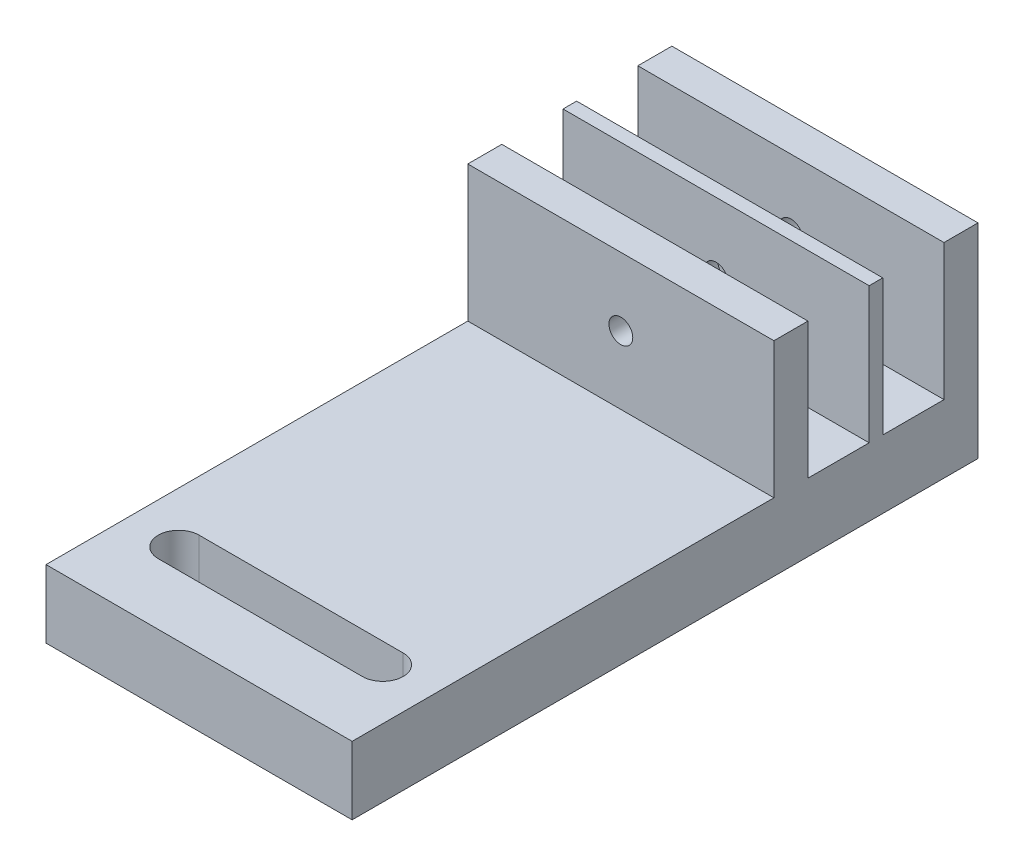
ISO-10303-21;
HEADER;
FILE_DESCRIPTION(('STEP AP214'),'2;1');
FILE_NAME('part.step','',(''),(''),'','','');
FILE_SCHEMA(('AUTOMOTIVE_DESIGN { 1 0 10303 214 1 1 1 1 }'));
ENDSEC;
DATA;
#1=APPLICATION_CONTEXT('core data for automotive mechanical design processes');
#2=APPLICATION_PROTOCOL_DEFINITION('international standard','automotive_design',2000,#1);
#3=PRODUCT_CONTEXT('',#1,'mechanical');
#4=PRODUCT('Part','Part','',(#3));
#5=PRODUCT_RELATED_PRODUCT_CATEGORY('part','',(#4));
#6=PRODUCT_DEFINITION_FORMATION('','',#4);
#7=PRODUCT_DEFINITION_CONTEXT('part definition',#1,'design');
#8=PRODUCT_DEFINITION('design','',#6,#7);
#9=PRODUCT_DEFINITION_SHAPE('','',#8);
#10=(LENGTH_UNIT() NAMED_UNIT(*) SI_UNIT(.MILLI.,.METRE.));
#11=(NAMED_UNIT(*) PLANE_ANGLE_UNIT() SI_UNIT($,.RADIAN.));
#12=(NAMED_UNIT(*) SI_UNIT($,.STERADIAN.) SOLID_ANGLE_UNIT());
#13=UNCERTAINTY_MEASURE_WITH_UNIT(LENGTH_MEASURE(1.E-05),#10,'distance_accuracy_value','');
#14=(GEOMETRIC_REPRESENTATION_CONTEXT(3) GLOBAL_UNCERTAINTY_ASSIGNED_CONTEXT((#13)) GLOBAL_UNIT_ASSIGNED_CONTEXT((#10,
#11,#12)) REPRESENTATION_CONTEXT('',''));
#15=CARTESIAN_POINT('',(0.,0.,0.));
#16=DIRECTION('',(0.,0.,1.));
#17=DIRECTION('',(1.,0.,0.));
#18=AXIS2_PLACEMENT_3D('',#15,#16,#17);
#19=CARTESIAN_POINT('',(0.,10.,0.));
#20=DIRECTION('',(0.,1.,0.));
#21=DIRECTION('',(0.,0.,1.));
#22=AXIS2_PLACEMENT_3D('',#19,#20,#21);
#23=PLANE('',#22);
#24=DIRECTION('',(0.,0.,-1.));
#25=VECTOR('',#24,1.);
#26=CARTESIAN_POINT('',(22.5,10.,0.));
#27=LINE('',#26,#25);
#28=CARTESIAN_POINT('',(22.5,10.,-49.5));
#29=VERTEX_POINT('',#28);
#30=CARTESIAN_POINT('',(22.5,10.,-58.5));
#31=VERTEX_POINT('',#30);
#32=EDGE_CURVE('E300',#29,#31,#27,.T.);
#33=ORIENTED_EDGE('',*,*,#32,.T.);
#34=DIRECTION('',(1.,0.,0.));
#35=VECTOR('',#34,1.);
#36=CARTESIAN_POINT('',(-43.1155281280883,10.,-58.5));
#37=LINE('',#36,#35);
#38=CARTESIAN_POINT('',(-22.5,10.,-58.5));
#39=VERTEX_POINT('',#38);
#40=EDGE_CURVE('E210',#39,#31,#37,.T.);
#41=ORIENTED_EDGE('',*,*,#40,.F.);
#42=DIRECTION('',(0.,0.,-1.));
#43=VECTOR('',#42,1.);
#44=CARTESIAN_POINT('',(-22.5,10.,0.));
#45=LINE('',#44,#43);
#46=CARTESIAN_POINT('',(-22.5,10.,-49.5));
#47=VERTEX_POINT('',#46);
#48=EDGE_CURVE('E63',#47,#39,#45,.T.);
#49=ORIENTED_EDGE('',*,*,#48,.F.);
#50=DIRECTION('',(1.,0.,0.));
#51=VECTOR('',#50,1.);
#52=CARTESIAN_POINT('',(-43.1155281280883,10.,-49.5));
#53=LINE('',#52,#51);
#54=EDGE_CURVE('E223',#47,#29,#53,.T.);
#55=ORIENTED_EDGE('',*,*,#54,.T.);
#56=EDGE_LOOP('',(#33,#41,#49,#55));
#57=FACE_BOUND('',#56,.T.);
#58=ADVANCED_FACE('F45',(#57),#23,.T.);
#59=CARTESIAN_POINT('',(22.5,10.,-38.5));
#60=VERTEX_POINT('',#59);
#61=CARTESIAN_POINT('',(22.5,10.,-47.5));
#62=VERTEX_POINT('',#61);
#63=EDGE_CURVE('E305',#60,#62,#27,.T.);
#64=ORIENTED_EDGE('',*,*,#63,.T.);
#65=DIRECTION('',(1.,0.,0.));
#66=VECTOR('',#65,1.);
#67=CARTESIAN_POINT('',(-43.1155281280883,10.,-47.5));
#68=LINE('',#67,#66);
#69=CARTESIAN_POINT('',(-22.5,10.,-47.5));
#70=VERTEX_POINT('',#69);
#71=EDGE_CURVE('E71',#70,#62,#68,.T.);
#72=ORIENTED_EDGE('',*,*,#71,.F.);
#73=CARTESIAN_POINT('',(-22.5,10.,-38.5));
#74=VERTEX_POINT('',#73);
#75=EDGE_CURVE('E296',#74,#70,#45,.T.);
#76=ORIENTED_EDGE('',*,*,#75,.F.);
#77=DIRECTION('',(1.,0.,0.));
#78=VECTOR('',#77,1.);
#79=CARTESIAN_POINT('',(-43.1155281280883,10.,-38.5));
#80=LINE('',#79,#78);
#81=EDGE_CURVE('E254',#74,#60,#80,.T.);
#82=ORIENTED_EDGE('',*,*,#81,.T.);
#83=EDGE_LOOP('',(#64,#72,#76,#82));
#84=FACE_BOUND('',#83,.T.);
#85=ADVANCED_FACE('F378',(#84),#23,.T.);
#86=CARTESIAN_POINT('',(0.,10.,13.5));
#87=DIRECTION('',(0.,0.,-1.));
#88=DIRECTION('',(-1.,0.,0.));
#89=AXIS2_PLACEMENT_3D('',#86,#87,#88);
#90=PLANE('',#89);
#91=DIRECTION('',(1.,0.,0.));
#92=VECTOR('',#91,1.);
#93=CARTESIAN_POINT('',(0.,0.,13.5));
#94=LINE('',#93,#92);
#95=CARTESIAN_POINT('',(-15.,0.,13.5));
#96=VERTEX_POINT('',#95);
#97=CARTESIAN_POINT('',(15.,0.,13.5));
#98=VERTEX_POINT('',#97);
#99=EDGE_CURVE('E330',#96,#98,#94,.T.);
#100=ORIENTED_EDGE('',*,*,#99,.T.);
#101=DIRECTION('',(0.,-1.,0.));
#102=VECTOR('',#101,1.);
#103=CARTESIAN_POINT('',(15.,10.,13.5));
#104=LINE('',#103,#102);
#105=CARTESIAN_POINT('',(15.,10.,13.5));
#106=VERTEX_POINT('',#105);
#107=EDGE_CURVE('E11',#106,#98,#104,.T.);
#108=ORIENTED_EDGE('',*,*,#107,.F.);
#109=DIRECTION('',(1.,0.,0.));
#110=VECTOR('',#109,1.);
#111=CARTESIAN_POINT('',(0.,10.,13.5));
#112=LINE('',#111,#110);
#113=CARTESIAN_POINT('',(-15.,10.,13.5));
#114=VERTEX_POINT('',#113);
#115=EDGE_CURVE('E304',#114,#106,#112,.T.);
#116=ORIENTED_EDGE('',*,*,#115,.F.);
#117=DIRECTION('',(0.,-1.,0.));
#118=VECTOR('',#117,1.);
#119=CARTESIAN_POINT('',(-15.,10.,13.5));
#120=LINE('',#119,#118);
#121=EDGE_CURVE('E346',#114,#96,#120,.T.);
#122=ORIENTED_EDGE('',*,*,#121,.T.);
#123=EDGE_LOOP('',(#100,#108,#116,#122));
#124=FACE_BOUND('',#123,.T.);
#125=ADVANCED_FACE('F418',(#124),#90,.F.);
#126=CARTESIAN_POINT('',(15.,10.,16.5));
#127=DIRECTION('',(0.,-1.,0.));
#128=DIRECTION('',(0.,0.,-1.));
#129=AXIS2_PLACEMENT_3D('',#126,#127,#128);
#130=CYLINDRICAL_SURFACE('',#129,3.);
#131=CARTESIAN_POINT('',(15.,0.,16.5));
#132=DIRECTION('',(0.,1.,0.));
#133=DIRECTION('',(0.,0.,1.));
#134=AXIS2_PLACEMENT_3D('',#131,#132,#133);
#135=CIRCLE('',#134,3.);
#136=CARTESIAN_POINT('',(15.,0.,19.5));
#137=VERTEX_POINT('',#136);
#138=EDGE_CURVE('E334',#98,#137,#135,.F.);
#139=ORIENTED_EDGE('',*,*,#138,.T.);
#140=DIRECTION('',(0.,-1.,0.));
#141=VECTOR('',#140,1.);
#142=CARTESIAN_POINT('',(15.,10.,19.5));
#143=LINE('',#142,#141);
#144=CARTESIAN_POINT('',(15.,10.,19.5));
#145=VERTEX_POINT('',#144);
#146=EDGE_CURVE('E55',#145,#137,#143,.T.);
#147=ORIENTED_EDGE('',*,*,#146,.F.);
#148=CARTESIAN_POINT('',(15.,10.,16.5));
#149=DIRECTION('',(0.,1.,0.));
#150=DIRECTION('',(0.,0.,1.));
#151=AXIS2_PLACEMENT_3D('',#148,#149,#150);
#152=CIRCLE('',#151,3.);
#153=EDGE_CURVE('E309',#106,#145,#152,.F.);
#154=ORIENTED_EDGE('',*,*,#153,.F.);
#155=ORIENTED_EDGE('',*,*,#107,.T.);
#156=EDGE_LOOP('',(#139,#147,#154,#155));
#157=FACE_BOUND('',#156,.T.);
#158=ADVANCED_FACE('F421',(#157),#130,.F.);
#159=CARTESIAN_POINT('',(0.,10.,19.5));
#160=DIRECTION('',(0.,0.,-1.));
#161=DIRECTION('',(-1.,0.,0.));
#162=AXIS2_PLACEMENT_3D('',#159,#160,#161);
#163=PLANE('',#162);
#164=DIRECTION('',(1.,0.,0.));
#165=VECTOR('',#164,1.);
#166=CARTESIAN_POINT('',(0.,0.,19.5));
#167=LINE('',#166,#165);
#168=CARTESIAN_POINT('',(-15.,0.,19.5));
#169=VERTEX_POINT('',#168);
#170=EDGE_CURVE('E338',#169,#137,#167,.T.);
#171=ORIENTED_EDGE('',*,*,#170,.F.);
#172=DIRECTION('',(0.,-1.,0.));
#173=VECTOR('',#172,1.);
#174=CARTESIAN_POINT('',(-15.,10.,19.5));
#175=LINE('',#174,#173);
#176=CARTESIAN_POINT('',(-15.,10.,19.5));
#177=VERTEX_POINT('',#176);
#178=EDGE_CURVE('E349',#177,#169,#175,.T.);
#179=ORIENTED_EDGE('',*,*,#178,.F.);
#180=DIRECTION('',(1.,0.,0.));
#181=VECTOR('',#180,1.);
#182=CARTESIAN_POINT('',(0.,10.,19.5));
#183=LINE('',#182,#181);
#184=EDGE_CURVE('E312',#177,#145,#183,.T.);
#185=ORIENTED_EDGE('',*,*,#184,.T.);
#186=ORIENTED_EDGE('',*,*,#146,.T.);
#187=EDGE_LOOP('',(#171,#179,#185,#186));
#188=FACE_BOUND('',#187,.T.);
#189=ADVANCED_FACE('F424',(#188),#163,.T.);
#190=CARTESIAN_POINT('',(-22.5,10.,0.));
#191=DIRECTION('',(-1.,0.,0.));
#192=DIRECTION('',(0.,0.,1.));
#193=AXIS2_PLACEMENT_3D('',#190,#191,#192);
#194=PLANE('',#193);
#195=DIRECTION('',(0.,0.,-1.));
#196=VECTOR('',#195,1.);
#197=CARTESIAN_POINT('',(-22.5,0.,0.));
#198=LINE('',#197,#196);
#199=CARTESIAN_POINT('',(-22.5,0.,28.5));
#200=VERTEX_POINT('',#199);
#201=CARTESIAN_POINT('',(-22.5,0.,-63.5));
#202=VERTEX_POINT('',#201);
#203=EDGE_CURVE('E290',#200,#202,#198,.T.);
#204=ORIENTED_EDGE('',*,*,#203,.F.);
#205=DIRECTION('',(0.,-1.,0.));
#206=VECTOR('',#205,1.);
#207=CARTESIAN_POINT('',(-22.5,10.,28.5));
#208=LINE('',#207,#206);
#209=CARTESIAN_POINT('',(-22.5,10.,28.5));
#210=VERTEX_POINT('',#209);
#211=EDGE_CURVE('E350',#210,#200,#208,.T.);
#212=ORIENTED_EDGE('',*,*,#211,.F.);
#213=CARTESIAN_POINT('',(-22.5,10.,-33.5));
#214=VERTEX_POINT('',#213);
#215=EDGE_CURVE('E291',#210,#214,#45,.T.);
#216=ORIENTED_EDGE('',*,*,#215,.T.);
#217=DIRECTION('',(0.,1.,0.));
#218=VECTOR('',#217,1.);
#219=CARTESIAN_POINT('',(-22.5,0.,-33.5));
#220=LINE('',#219,#218);
#221=CARTESIAN_POINT('',(-22.5,30.,-33.5));
#222=VERTEX_POINT('',#221);
#223=EDGE_CURVE('E249',#214,#222,#220,.T.);
#224=ORIENTED_EDGE('',*,*,#223,.T.);
#225=DIRECTION('',(0.,0.,1.));
#226=VECTOR('',#225,1.);
#227=CARTESIAN_POINT('',(-22.5,30.,0.));
#228=LINE('',#227,#226);
#229=CARTESIAN_POINT('',(-22.5,30.,-38.5));
#230=VERTEX_POINT('',#229);
#231=EDGE_CURVE('E259',#230,#222,#228,.T.);
#232=ORIENTED_EDGE('',*,*,#231,.F.);
#233=DIRECTION('',(0.,1.,0.));
#234=VECTOR('',#233,1.);
#235=CARTESIAN_POINT('',(-22.5,0.,-38.5));
#236=LINE('',#235,#234);
#237=EDGE_CURVE('E260',#74,#230,#236,.T.);
#238=ORIENTED_EDGE('',*,*,#237,.F.);
#239=ORIENTED_EDGE('',*,*,#75,.T.);
#240=DIRECTION('',(0.,1.,0.));
#241=VECTOR('',#240,1.);
#242=CARTESIAN_POINT('',(-22.5,0.,-47.5));
#243=LINE('',#242,#241);
#244=CARTESIAN_POINT('',(-22.5,30.,-47.5));
#245=VERTEX_POINT('',#244);
#246=EDGE_CURVE('E218',#70,#245,#243,.T.);
#247=ORIENTED_EDGE('',*,*,#246,.T.);
#248=DIRECTION('',(0.,0.,1.));
#249=VECTOR('',#248,1.);
#250=CARTESIAN_POINT('',(-22.5,30.0000000000001,0.));
#251=LINE('',#250,#249);
#252=CARTESIAN_POINT('',(-22.5,30.,-49.5));
#253=VERTEX_POINT('',#252);
#254=EDGE_CURVE('E227',#253,#245,#251,.T.);
#255=ORIENTED_EDGE('',*,*,#254,.F.);
#256=DIRECTION('',(0.,1.,0.));
#257=VECTOR('',#256,1.);
#258=CARTESIAN_POINT('',(-22.5,0.,-49.5));
#259=LINE('',#258,#257);
#260=EDGE_CURVE('E228',#47,#253,#259,.T.);
#261=ORIENTED_EDGE('',*,*,#260,.F.);
#262=ORIENTED_EDGE('',*,*,#48,.T.);
#263=DIRECTION('',(0.,1.,0.));
#264=VECTOR('',#263,1.);
#265=CARTESIAN_POINT('',(-22.5,0.,-58.5));
#266=LINE('',#265,#264);
#267=CARTESIAN_POINT('',(-22.5,30.,-58.5));
#268=VERTEX_POINT('',#267);
#269=EDGE_CURVE('E191',#39,#268,#266,.T.);
#270=ORIENTED_EDGE('',*,*,#269,.T.);
#271=DIRECTION('',(0.,0.,1.));
#272=VECTOR('',#271,1.);
#273=CARTESIAN_POINT('',(-22.5,30.,0.));
#274=LINE('',#273,#272);
#275=CARTESIAN_POINT('',(-22.5,30.,-63.5));
#276=VERTEX_POINT('',#275);
#277=EDGE_CURVE('E175',#276,#268,#274,.T.);
#278=ORIENTED_EDGE('',*,*,#277,.F.);
#279=DIRECTION('',(0.,1.,0.));
#280=VECTOR('',#279,1.);
#281=CARTESIAN_POINT('',(-22.5,10.,-63.5));
#282=LINE('',#281,#280);
#283=EDGE_CURVE('E270',#202,#276,#282,.T.);
#284=ORIENTED_EDGE('',*,*,#283,.F.);
#285=EDGE_LOOP('',(#204,#212,#216,#224,#232,#238,#239,#247,#255,#261,#262,#270,#278,#284));
#286=FACE_BOUND('',#285,.T.);
#287=ADVANCED_FACE('F47',(#286),#194,.T.);
#288=CARTESIAN_POINT('',(0.,10.,28.5));
#289=DIRECTION('',(0.,0.,1.));
#290=DIRECTION('',(1.,0.,0.));
#291=AXIS2_PLACEMENT_3D('',#288,#289,#290);
#292=PLANE('',#291);
#293=DIRECTION('',(-1.,0.,0.));
#294=VECTOR('',#293,1.);
#295=CARTESIAN_POINT('',(0.,0.,28.5));
#296=LINE('',#295,#294);
#297=CARTESIAN_POINT('',(22.5,0.,28.5));
#298=VERTEX_POINT('',#297);
#299=EDGE_CURVE('E323',#298,#200,#296,.T.);
#300=ORIENTED_EDGE('',*,*,#299,.F.);
#301=DIRECTION('',(0.,-1.,0.));
#302=VECTOR('',#301,1.);
#303=CARTESIAN_POINT('',(22.5,10.,28.5));
#304=LINE('',#303,#302);
#305=CARTESIAN_POINT('',(22.5,10.,28.5));
#306=VERTEX_POINT('',#305);
#307=EDGE_CURVE('E320',#306,#298,#304,.T.);
#308=ORIENTED_EDGE('',*,*,#307,.F.);
#309=DIRECTION('',(-1.,0.,0.));
#310=VECTOR('',#309,1.);
#311=CARTESIAN_POINT('',(0.,10.,28.5));
#312=LINE('',#311,#310);
#313=EDGE_CURVE('E295',#306,#210,#312,.T.);
#314=ORIENTED_EDGE('',*,*,#313,.T.);
#315=ORIENTED_EDGE('',*,*,#211,.T.);
#316=EDGE_LOOP('',(#300,#308,#314,#315));
#317=FACE_BOUND('',#316,.T.);
#318=ADVANCED_FACE('F359',(#317),#292,.T.);
#319=CARTESIAN_POINT('',(22.5,10.,0.));
#320=DIRECTION('',(-1.,0.,0.));
#321=DIRECTION('',(0.,0.,1.));
#322=AXIS2_PLACEMENT_3D('',#319,#320,#321);
#323=PLANE('',#322);
#324=DIRECTION('',(0.,0.,-1.));
#325=VECTOR('',#324,1.);
#326=CARTESIAN_POINT('',(22.5,0.,0.));
#327=LINE('',#326,#325);
#328=CARTESIAN_POINT('',(22.5,0.,-63.5));
#329=VERTEX_POINT('',#328);
#330=EDGE_CURVE('E327',#298,#329,#327,.T.);
#331=ORIENTED_EDGE('',*,*,#330,.T.);
#332=DIRECTION('',(0.,-1.,0.));
#333=VECTOR('',#332,1.);
#334=CARTESIAN_POINT('',(22.5,10.,-63.5));
#335=LINE('',#334,#333);
#336=CARTESIAN_POINT('',(22.5,30.,-63.5));
#337=VERTEX_POINT('',#336);
#338=EDGE_CURVE('E282',#337,#329,#335,.T.);
#339=ORIENTED_EDGE('',*,*,#338,.F.);
#340=DIRECTION('',(0.,0.,1.));
#341=VECTOR('',#340,1.);
#342=CARTESIAN_POINT('',(22.5,30.,0.));
#343=LINE('',#342,#341);
#344=CARTESIAN_POINT('',(22.5,30.,-58.5));
#345=VERTEX_POINT('',#344);
#346=EDGE_CURVE('E199',#337,#345,#343,.T.);
#347=ORIENTED_EDGE('',*,*,#346,.T.);
#348=DIRECTION('',(0.,1.,0.));
#349=VECTOR('',#348,1.);
#350=CARTESIAN_POINT('',(22.5,0.,-58.5));
#351=LINE('',#350,#349);
#352=EDGE_CURVE('E187',#31,#345,#351,.T.);
#353=ORIENTED_EDGE('',*,*,#352,.F.);
#354=ORIENTED_EDGE('',*,*,#32,.F.);
#355=DIRECTION('',(0.,1.,0.));
#356=VECTOR('',#355,1.);
#357=CARTESIAN_POINT('',(22.5,0.,-49.5));
#358=LINE('',#357,#356);
#359=CARTESIAN_POINT('',(22.5,30.,-49.5));
#360=VERTEX_POINT('',#359);
#361=EDGE_CURVE('E219',#29,#360,#358,.T.);
#362=ORIENTED_EDGE('',*,*,#361,.T.);
#363=DIRECTION('',(0.,0.,1.));
#364=VECTOR('',#363,1.);
#365=CARTESIAN_POINT('',(22.5,30.0000000000001,0.));
#366=LINE('',#365,#364);
#367=CARTESIAN_POINT('',(22.5,30.,-47.5));
#368=VERTEX_POINT('',#367);
#369=EDGE_CURVE('E214',#360,#368,#366,.T.);
#370=ORIENTED_EDGE('',*,*,#369,.T.);
#371=DIRECTION('',(0.,1.,0.));
#372=VECTOR('',#371,1.);
#373=CARTESIAN_POINT('',(22.5,0.,-47.5));
#374=LINE('',#373,#372);
#375=EDGE_CURVE('E203',#62,#368,#374,.T.);
#376=ORIENTED_EDGE('',*,*,#375,.F.);
#377=ORIENTED_EDGE('',*,*,#63,.F.);
#378=DIRECTION('',(0.,1.,0.));
#379=VECTOR('',#378,1.);
#380=CARTESIAN_POINT('',(22.5,0.,-38.5));
#381=LINE('',#380,#379);
#382=CARTESIAN_POINT('',(22.5,30.,-38.5));
#383=VERTEX_POINT('',#382);
#384=EDGE_CURVE('E250',#60,#383,#381,.T.);
#385=ORIENTED_EDGE('',*,*,#384,.T.);
#386=DIRECTION('',(0.,0.,1.));
#387=VECTOR('',#386,1.);
#388=CARTESIAN_POINT('',(22.5,30.,0.));
#389=LINE('',#388,#387);
#390=CARTESIAN_POINT('',(22.5,30.,-33.5));
#391=VERTEX_POINT('',#390);
#392=EDGE_CURVE('E245',#383,#391,#389,.T.);
#393=ORIENTED_EDGE('',*,*,#392,.T.);
#394=DIRECTION('',(0.,1.,0.));
#395=VECTOR('',#394,1.);
#396=CARTESIAN_POINT('',(22.5,0.,-33.5));
#397=LINE('',#396,#395);
#398=CARTESIAN_POINT('',(22.5,10.,-33.5));
#399=VERTEX_POINT('',#398);
#400=EDGE_CURVE('E255',#399,#391,#397,.T.);
#401=ORIENTED_EDGE('',*,*,#400,.F.);
#402=EDGE_CURVE('E301',#306,#399,#27,.T.);
#403=ORIENTED_EDGE('',*,*,#402,.F.);
#404=ORIENTED_EDGE('',*,*,#307,.T.);
#405=EDGE_LOOP('',(#331,#339,#347,#353,#354,#362,#370,#376,#377,#385,#393,#401,#403,#404));
#406=FACE_BOUND('',#405,.T.);
#407=ADVANCED_FACE('F368',(#406),#323,.F.);
#408=CARTESIAN_POINT('',(-15.,10.,16.5));
#409=DIRECTION('',(0.,-1.,0.));
#410=DIRECTION('',(0.,0.,-1.));
#411=AXIS2_PLACEMENT_3D('',#408,#409,#410);
#412=CYLINDRICAL_SURFACE('',#411,3.);
#413=CARTESIAN_POINT('',(-15.,0.,16.5));
#414=DIRECTION('',(0.,1.,0.));
#415=DIRECTION('',(0.,0.,1.));
#416=AXIS2_PLACEMENT_3D('',#413,#414,#415);
#417=CIRCLE('',#416,3.);
#418=EDGE_CURVE('E342',#96,#169,#417,.T.);
#419=ORIENTED_EDGE('',*,*,#418,.F.);
#420=ORIENTED_EDGE('',*,*,#121,.F.);
#421=CARTESIAN_POINT('',(-15.,10.,16.5));
#422=DIRECTION('',(0.,1.,0.));
#423=DIRECTION('',(0.,0.,1.));
#424=AXIS2_PLACEMENT_3D('',#421,#422,#423);
#425=CIRCLE('',#424,3.);
#426=EDGE_CURVE('E316',#114,#177,#425,.T.);
#427=ORIENTED_EDGE('',*,*,#426,.T.);
#428=ORIENTED_EDGE('',*,*,#178,.T.);
#429=EDGE_LOOP('',(#419,#420,#427,#428));
#430=FACE_BOUND('',#429,.T.);
#431=ADVANCED_FACE('F410',(#430),#412,.F.);
#432=DIRECTION('',(1.,0.,0.));
#433=VECTOR('',#432,1.);
#434=CARTESIAN_POINT('',(-43.1155281280883,10.,-33.5));
#435=LINE('',#434,#433);
#436=EDGE_CURVE('E238',#214,#399,#435,.T.);
#437=ORIENTED_EDGE('',*,*,#436,.F.);
#438=ORIENTED_EDGE('',*,*,#215,.F.);
#439=ORIENTED_EDGE('',*,*,#313,.F.);
#440=ORIENTED_EDGE('',*,*,#402,.T.);
#441=EDGE_LOOP('',(#437,#438,#439,#440));
#442=FACE_BOUND('',#441,.T.);
#443=ORIENTED_EDGE('',*,*,#115,.T.);
#444=ORIENTED_EDGE('',*,*,#153,.T.);
#445=ORIENTED_EDGE('',*,*,#184,.F.);
#446=ORIENTED_EDGE('',*,*,#426,.F.);
#447=EDGE_LOOP('',(#443,#444,#445,#446));
#448=FACE_BOUND('',#447,.T.);
#449=ADVANCED_FACE('F407',(#442,#448),#23,.T.);
#450=CARTESIAN_POINT('',(0.,0.,0.));
#451=DIRECTION('',(0.,1.,0.));
#452=DIRECTION('',(0.,0.,1.));
#453=AXIS2_PLACEMENT_3D('',#450,#451,#452);
#454=PLANE('',#453);
#455=ORIENTED_EDGE('',*,*,#203,.T.);
#456=DIRECTION('',(-1.,0.,0.));
#457=VECTOR('',#456,1.);
#458=CARTESIAN_POINT('',(22.5,0.,-63.5));
#459=LINE('',#458,#457);
#460=EDGE_CURVE('E286',#329,#202,#459,.T.);
#461=ORIENTED_EDGE('',*,*,#460,.F.);
#462=ORIENTED_EDGE('',*,*,#330,.F.);
#463=ORIENTED_EDGE('',*,*,#299,.T.);
#464=EDGE_LOOP('',(#455,#461,#462,#463));
#465=FACE_BOUND('',#464,.T.);
#466=ORIENTED_EDGE('',*,*,#99,.F.);
#467=ORIENTED_EDGE('',*,*,#418,.T.);
#468=ORIENTED_EDGE('',*,*,#170,.T.);
#469=ORIENTED_EDGE('',*,*,#138,.F.);
#470=EDGE_LOOP('',(#466,#467,#468,#469));
#471=FACE_BOUND('',#470,.T.);
#472=ADVANCED_FACE('F365',(#465,#471),#454,.F.);
#473=CARTESIAN_POINT('',(0.,0.,-63.5));
#474=DIRECTION('',(0.,0.,-1.));
#475=DIRECTION('',(-1.,0.,0.));
#476=AXIS2_PLACEMENT_3D('',#473,#474,#475);
#477=PLANE('',#476);
#478=CARTESIAN_POINT('',(0.,20.,-63.5));
#479=DIRECTION('',(0.,0.,-1.));
#480=DIRECTION('',(-1.,0.,0.));
#481=AXIS2_PLACEMENT_3D('',#478,#479,#480);
#482=CIRCLE('',#481,1.75);
#483=CARTESIAN_POINT('',(1.75,20.,-63.5));
#484=VERTEX_POINT('',#483);
#485=EDGE_CURVE('E480',#484,#484,#482,.F.);
#486=ORIENTED_EDGE('',*,*,#485,.T.);
#487=EDGE_LOOP('',(#486));
#488=FACE_BOUND('',#487,.T.);
#489=ORIENTED_EDGE('',*,*,#283,.T.);
#490=DIRECTION('',(1.,0.,0.));
#491=VECTOR('',#490,1.);
#492=CARTESIAN_POINT('',(-43.1155281280883,30.,-63.5));
#493=LINE('',#492,#491);
#494=EDGE_CURVE('E182',#276,#337,#493,.T.);
#495=ORIENTED_EDGE('',*,*,#494,.T.);
#496=ORIENTED_EDGE('',*,*,#338,.T.);
#497=ORIENTED_EDGE('',*,*,#460,.T.);
#498=EDGE_LOOP('',(#489,#495,#496,#497));
#499=FACE_BOUND('',#498,.T.);
#500=ADVANCED_FACE('F371',(#488,#499),#477,.T.);
#501=CARTESIAN_POINT('',(-43.1155281280883,0.,-33.5));
#502=DIRECTION('',(0.,0.,-1.));
#503=DIRECTION('',(0.,1.,0.));
#504=AXIS2_PLACEMENT_3D('',#501,#502,#503);
#505=PLANE('',#504);
#506=CARTESIAN_POINT('',(0.,20.,-33.5));
#507=DIRECTION('',(0.,0.,1.));
#508=DIRECTION('',(1.,0.,0.));
#509=AXIS2_PLACEMENT_3D('',#506,#507,#508);
#510=CIRCLE('',#509,1.75);
#511=CARTESIAN_POINT('',(1.75,20.,-33.5));
#512=VERTEX_POINT('',#511);
#513=EDGE_CURVE('E490',#512,#512,#510,.T.);
#514=ORIENTED_EDGE('',*,*,#513,.F.);
#515=EDGE_LOOP('',(#514));
#516=FACE_BOUND('',#515,.T.);
#517=ORIENTED_EDGE('',*,*,#223,.F.);
#518=ORIENTED_EDGE('',*,*,#436,.T.);
#519=ORIENTED_EDGE('',*,*,#400,.T.);
#520=DIRECTION('',(1.,0.,0.));
#521=VECTOR('',#520,1.);
#522=CARTESIAN_POINT('',(-43.1155281280883,30.,-33.5));
#523=LINE('',#522,#521);
#524=EDGE_CURVE('E264',#222,#391,#523,.T.);
#525=ORIENTED_EDGE('',*,*,#524,.F.);
#526=EDGE_LOOP('',(#517,#518,#519,#525));
#527=FACE_BOUND('',#526,.T.);
#528=ADVANCED_FACE('F405',(#516,#527),#505,.F.);
#529=CARTESIAN_POINT('',(-43.1155281280883,30.,0.));
#530=DIRECTION('',(0.,1.,0.));
#531=DIRECTION('',(0.,0.,1.));
#532=AXIS2_PLACEMENT_3D('',#529,#530,#531);
#533=PLANE('',#532);
#534=DIRECTION('',(1.,0.,0.));
#535=VECTOR('',#534,1.);
#536=CARTESIAN_POINT('',(-43.1155281280883,30.,-38.5));
#537=LINE('',#536,#535);
#538=EDGE_CURVE('E263',#230,#383,#537,.T.);
#539=ORIENTED_EDGE('',*,*,#538,.F.);
#540=ORIENTED_EDGE('',*,*,#231,.T.);
#541=ORIENTED_EDGE('',*,*,#524,.T.);
#542=ORIENTED_EDGE('',*,*,#392,.F.);
#543=EDGE_LOOP('',(#539,#540,#541,#542));
#544=FACE_BOUND('',#543,.T.);
#545=ADVANCED_FACE('F401',(#544),#533,.T.);
#546=CARTESIAN_POINT('',(-43.1155281280883,0.,-38.5));
#547=DIRECTION('',(0.,0.,-1.));
#548=DIRECTION('',(-1.,0.,0.));
#549=AXIS2_PLACEMENT_3D('',#546,#547,#548);
#550=PLANE('',#549);
#551=CARTESIAN_POINT('',(0.,20.,-38.5));
#552=DIRECTION('',(0.,0.,-1.));
#553=DIRECTION('',(-1.,0.,0.));
#554=AXIS2_PLACEMENT_3D('',#551,#552,#553);
#555=CIRCLE('',#554,1.75);
#556=CARTESIAN_POINT('',(1.75,20.,-38.5));
#557=VERTEX_POINT('',#556);
#558=EDGE_CURVE('E213',#557,#557,#555,.T.);
#559=ORIENTED_EDGE('',*,*,#558,.F.);
#560=EDGE_LOOP('',(#559));
#561=FACE_BOUND('',#560,.T.);
#562=ORIENTED_EDGE('',*,*,#81,.F.);
#563=ORIENTED_EDGE('',*,*,#237,.T.);
#564=ORIENTED_EDGE('',*,*,#538,.T.);
#565=ORIENTED_EDGE('',*,*,#384,.F.);
#566=EDGE_LOOP('',(#562,#563,#564,#565));
#567=FACE_BOUND('',#566,.T.);
#568=ADVANCED_FACE('F396',(#561,#567),#550,.T.);
#569=CARTESIAN_POINT('',(-43.1155281280883,0.,-47.5));
#570=DIRECTION('',(0.,0.,-1.));
#571=DIRECTION('',(-1.,0.,0.));
#572=AXIS2_PLACEMENT_3D('',#569,#570,#571);
#573=PLANE('',#572);
#574=CARTESIAN_POINT('',(0.,20.,-47.5));
#575=DIRECTION('',(0.,0.,-1.));
#576=DIRECTION('',(-1.,0.,0.));
#577=AXIS2_PLACEMENT_3D('',#574,#575,#576);
#578=CIRCLE('',#577,1.75);
#579=CARTESIAN_POINT('',(1.75,20.,-47.5));
#580=VERTEX_POINT('',#579);
#581=EDGE_CURVE('E488',#580,#580,#578,.T.);
#582=ORIENTED_EDGE('',*,*,#581,.T.);
#583=EDGE_LOOP('',(#582));
#584=FACE_BOUND('',#583,.T.);
#585=ORIENTED_EDGE('',*,*,#246,.F.);
#586=ORIENTED_EDGE('',*,*,#71,.T.);
#587=ORIENTED_EDGE('',*,*,#375,.T.);
#588=DIRECTION('',(1.,0.,0.));
#589=VECTOR('',#588,1.);
#590=CARTESIAN_POINT('',(-43.1155281280883,30.,-47.5));
#591=LINE('',#590,#589);
#592=EDGE_CURVE('E232',#245,#368,#591,.T.);
#593=ORIENTED_EDGE('',*,*,#592,.F.);
#594=EDGE_LOOP('',(#585,#586,#587,#593));
#595=FACE_BOUND('',#594,.T.);
#596=ADVANCED_FACE('F384',(#584,#595),#573,.F.);
#597=CARTESIAN_POINT('',(-43.1155281280883,30.0000000000001,0.));
#598=DIRECTION('',(0.,1.,0.));
#599=DIRECTION('',(0.,0.,1.));
#600=AXIS2_PLACEMENT_3D('',#597,#598,#599);
#601=PLANE('',#600);
#602=DIRECTION('',(1.,0.,0.));
#603=VECTOR('',#602,1.);
#604=CARTESIAN_POINT('',(-43.1155281280883,30.,-49.5));
#605=LINE('',#604,#603);
#606=EDGE_CURVE('E231',#253,#360,#605,.T.);
#607=ORIENTED_EDGE('',*,*,#606,.F.);
#608=ORIENTED_EDGE('',*,*,#254,.T.);
#609=ORIENTED_EDGE('',*,*,#592,.T.);
#610=ORIENTED_EDGE('',*,*,#369,.F.);
#611=EDGE_LOOP('',(#607,#608,#609,#610));
#612=FACE_BOUND('',#611,.T.);
#613=ADVANCED_FACE('F389',(#612),#601,.T.);
#614=CARTESIAN_POINT('',(-43.1155281280883,0.,-49.5));
#615=DIRECTION('',(0.,0.,-1.));
#616=DIRECTION('',(-1.,0.,0.));
#617=AXIS2_PLACEMENT_3D('',#614,#615,#616);
#618=PLANE('',#617);
#619=CARTESIAN_POINT('',(0.,20.,-49.5));
#620=DIRECTION('',(0.,0.,-1.));
#621=DIRECTION('',(-1.,0.,0.));
#622=AXIS2_PLACEMENT_3D('',#619,#620,#621);
#623=CIRCLE('',#622,1.75);
#624=CARTESIAN_POINT('',(1.75,20.,-49.5));
#625=VERTEX_POINT('',#624);
#626=EDGE_CURVE('E484',#625,#625,#623,.T.);
#627=ORIENTED_EDGE('',*,*,#626,.F.);
#628=EDGE_LOOP('',(#627));
#629=FACE_BOUND('',#628,.T.);
#630=ORIENTED_EDGE('',*,*,#54,.F.);
#631=ORIENTED_EDGE('',*,*,#260,.T.);
#632=ORIENTED_EDGE('',*,*,#606,.T.);
#633=ORIENTED_EDGE('',*,*,#361,.F.);
#634=EDGE_LOOP('',(#630,#631,#632,#633));
#635=FACE_BOUND('',#634,.T.);
#636=ADVANCED_FACE('F453',(#629,#635),#618,.T.);
#637=CARTESIAN_POINT('',(-43.1155281280883,0.,-58.5));
#638=DIRECTION('',(0.,0.,-1.));
#639=DIRECTION('',(-1.,0.,0.));
#640=AXIS2_PLACEMENT_3D('',#637,#638,#639);
#641=PLANE('',#640);
#642=CARTESIAN_POINT('',(0.,20.,-58.5));
#643=DIRECTION('',(0.,0.,-1.));
#644=DIRECTION('',(-1.,0.,0.));
#645=AXIS2_PLACEMENT_3D('',#642,#643,#644);
#646=CIRCLE('',#645,1.75);
#647=CARTESIAN_POINT('',(1.75,20.,-58.5));
#648=VERTEX_POINT('',#647);
#649=EDGE_CURVE('E49',#648,#648,#646,.T.);
#650=ORIENTED_EDGE('',*,*,#649,.T.);
#651=EDGE_LOOP('',(#650));
#652=FACE_BOUND('',#651,.T.);
#653=ORIENTED_EDGE('',*,*,#269,.F.);
#654=ORIENTED_EDGE('',*,*,#40,.T.);
#655=ORIENTED_EDGE('',*,*,#352,.T.);
#656=DIRECTION('',(1.,0.,0.));
#657=VECTOR('',#656,1.);
#658=CARTESIAN_POINT('',(-43.1155281280883,30.,-58.5));
#659=LINE('',#658,#657);
#660=EDGE_CURVE('E179',#268,#345,#659,.T.);
#661=ORIENTED_EDGE('',*,*,#660,.F.);
#662=EDGE_LOOP('',(#653,#654,#655,#661));
#663=FACE_BOUND('',#662,.T.);
#664=ADVANCED_FACE('F190',(#652,#663),#641,.F.);
#665=CARTESIAN_POINT('',(-43.1155281280883,30.,0.));
#666=DIRECTION('',(0.,1.,0.));
#667=DIRECTION('',(0.,0.,1.));
#668=AXIS2_PLACEMENT_3D('',#665,#666,#667);
#669=PLANE('',#668);
#670=ORIENTED_EDGE('',*,*,#494,.F.);
#671=ORIENTED_EDGE('',*,*,#277,.T.);
#672=ORIENTED_EDGE('',*,*,#660,.T.);
#673=ORIENTED_EDGE('',*,*,#346,.F.);
#674=EDGE_LOOP('',(#670,#671,#672,#673));
#675=FACE_BOUND('',#674,.T.);
#676=ADVANCED_FACE('F177',(#675),#669,.T.);
#677=CARTESIAN_POINT('',(0.,20.,-68.4497474683058));
#678=DIRECTION('',(0.,0.,1.));
#679=DIRECTION('',(1.,0.,0.));
#680=AXIS2_PLACEMENT_3D('',#677,#678,#679);
#681=CYLINDRICAL_SURFACE('',#680,1.75);
#682=CARTESIAN_POINT('',(1.75,20.,-63.5));
#683=CARTESIAN_POINT('',(1.75,20.,-63.4479166666667));
#684=CARTESIAN_POINT('',(1.75,20.,-63.3958333333333));
#685=CARTESIAN_POINT('',(1.75,20.,-63.2916666666667));
#686=CARTESIAN_POINT('',(1.75,20.,-63.2395833333333));
#687=CARTESIAN_POINT('',(1.75,20.,-63.1354166666667));
#688=CARTESIAN_POINT('',(1.75,20.,-63.0833333333333));
#689=CARTESIAN_POINT('',(1.75,20.,-62.9791666666667));
#690=CARTESIAN_POINT('',(1.75,20.,-62.9270833333333));
#691=CARTESIAN_POINT('',(1.75,20.,-62.8229166666667));
#692=CARTESIAN_POINT('',(1.75,20.,-62.7708333333333));
#693=CARTESIAN_POINT('',(1.75,20.,-62.6666666666667));
#694=CARTESIAN_POINT('',(1.75,20.,-62.6145833333333));
#695=CARTESIAN_POINT('',(1.75,20.,-62.5104166666667));
#696=CARTESIAN_POINT('',(1.75,20.,-62.4583333333333));
#697=CARTESIAN_POINT('',(1.75,20.,-62.3541666666667));
#698=CARTESIAN_POINT('',(1.75,20.,-62.3020833333333));
#699=CARTESIAN_POINT('',(1.75,20.,-62.1979166666667));
#700=CARTESIAN_POINT('',(1.75,20.,-62.1458333333333));
#701=CARTESIAN_POINT('',(1.75,20.,-62.0416666666667));
#702=CARTESIAN_POINT('',(1.75,20.,-61.9895833333333));
#703=CARTESIAN_POINT('',(1.75,20.,-61.8854166666667));
#704=CARTESIAN_POINT('',(1.75,20.,-61.8333333333333));
#705=CARTESIAN_POINT('',(1.75,20.,-61.7291666666667));
#706=CARTESIAN_POINT('',(1.75,20.,-61.6770833333333));
#707=CARTESIAN_POINT('',(1.75,20.,-61.5729166666667));
#708=CARTESIAN_POINT('',(1.75,20.,-61.5208333333333));
#709=CARTESIAN_POINT('',(1.75,20.,-61.4166666666667));
#710=CARTESIAN_POINT('',(1.75,20.,-61.3645833333333));
#711=CARTESIAN_POINT('',(1.75,20.,-61.2604166666667));
#712=CARTESIAN_POINT('',(1.75,20.,-61.2083333333333));
#713=CARTESIAN_POINT('',(1.75,20.,-61.1041666666667));
#714=CARTESIAN_POINT('',(1.75,20.,-61.0520833333333));
#715=CARTESIAN_POINT('',(1.75,20.,-60.9479166666667));
#716=CARTESIAN_POINT('',(1.75,20.,-60.8958333333333));
#717=CARTESIAN_POINT('',(1.75,20.,-60.7916666666667));
#718=CARTESIAN_POINT('',(1.75,20.,-60.7395833333333));
#719=CARTESIAN_POINT('',(1.75,20.,-60.6354166666667));
#720=CARTESIAN_POINT('',(1.75,20.,-60.5833333333333));
#721=CARTESIAN_POINT('',(1.75,20.,-60.4791666666667));
#722=CARTESIAN_POINT('',(1.75,20.,-60.4270833333333));
#723=CARTESIAN_POINT('',(1.75,20.,-60.3229166666667));
#724=CARTESIAN_POINT('',(1.75,20.,-60.2708333333333));
#725=CARTESIAN_POINT('',(1.75,20.,-60.1666666666667));
#726=CARTESIAN_POINT('',(1.75,20.,-60.1145833333333));
#727=CARTESIAN_POINT('',(1.75,20.,-60.0104166666667));
#728=CARTESIAN_POINT('',(1.75,20.,-59.9583333333333));
#729=CARTESIAN_POINT('',(1.75,20.,-59.8541666666667));
#730=CARTESIAN_POINT('',(1.75,20.,-59.8020833333333));
#731=CARTESIAN_POINT('',(1.75,20.,-59.6979166666667));
#732=CARTESIAN_POINT('',(1.75,20.,-59.6458333333333));
#733=CARTESIAN_POINT('',(1.75,20.,-59.5416666666667));
#734=CARTESIAN_POINT('',(1.75,20.,-59.4895833333333));
#735=CARTESIAN_POINT('',(1.75,20.,-59.3854166666667));
#736=CARTESIAN_POINT('',(1.75,20.,-59.3333333333333));
#737=CARTESIAN_POINT('',(1.75,20.,-59.2291666666667));
#738=CARTESIAN_POINT('',(1.75,20.,-59.1770833333333));
#739=CARTESIAN_POINT('',(1.75,20.,-59.0729166666667));
#740=CARTESIAN_POINT('',(1.75,20.,-59.0208333333333));
#741=CARTESIAN_POINT('',(1.75,20.,-58.9166666666667));
#742=CARTESIAN_POINT('',(1.75,20.,-58.8645833333333));
#743=CARTESIAN_POINT('',(1.75,20.,-58.7604166666667));
#744=CARTESIAN_POINT('',(1.75,20.,-58.7083333333333));
#745=CARTESIAN_POINT('',(1.75,20.,-58.6041666666667));
#746=CARTESIAN_POINT('',(1.75,20.,-58.5520833333333));
#747=CARTESIAN_POINT('',(1.75,20.,-58.5));
#748=B_SPLINE_CURVE_WITH_KNOTS('',3,(#682,#683,#684,#685,#686,#687,#688,#689,#690,#691,#692,
#693,#694,#695,#696,#697,#698,#699,#700,#701,#702,#703,#704,#705,#706,#707,#708,#709,#710,#711,
#712,#713,#714,#715,#716,#717,#718,#719,#720,#721,#722,#723,#724,#725,#726,#727,#728,#729,#730,
#731,#732,#733,#734,#735,#736,#737,#738,#739,#740,#741,#742,#743,#744,#745,#746,#747),
.UNSPECIFIED.,.F.,.F.,(4,2,2,2,2,2,2,2,2,2,2,2,2,2,2,2,2,2,2,2,2,2,2,2,2,2,2,2,2,2,2,2,4),(0.,
0.156250000000011,0.312500000000007,0.468750000000004,0.625000000000001,0.781250000000011,
0.937500000000008,1.09375,1.25,1.40625,1.5625,1.71875,1.875,2.03125000000001,2.1875,
2.34375000000001,2.5,2.65625000000001,2.8125,2.96875,3.125,3.28125,3.4375,3.59375,3.75,3.90625,
4.0625,4.21875,4.375,4.53125,4.6875,4.84375,5.),.UNSPECIFIED.);
#749=EDGE_CURVE('BSEAM462',#484,#648,#748,.T.);
#750=ORIENTED_EDGE('',*,*,#485,.F.);
#751=ORIENTED_EDGE('',*,*,#649,.F.);
#752=ORIENTED_EDGE('',*,*,#749,.T.);
#753=ORIENTED_EDGE('',*,*,#749,.F.);
#754=EDGE_LOOP('',(#750,#752,#751,#753));
#755=FACE_BOUND('',#754,.T.);
#756=ADVANCED_FACE('F462',(#755),#681,.F.);
#757=CARTESIAN_POINT('',(1.75,20.,-49.5));
#758=CARTESIAN_POINT('',(1.75,20.,-49.4791666666667));
#759=CARTESIAN_POINT('',(1.75,20.,-49.4583333333333));
#760=CARTESIAN_POINT('',(1.75,20.,-49.4166666666667));
#761=CARTESIAN_POINT('',(1.75,20.,-49.3958333333333));
#762=CARTESIAN_POINT('',(1.75,20.,-49.3541666666667));
#763=CARTESIAN_POINT('',(1.75,20.,-49.3333333333333));
#764=CARTESIAN_POINT('',(1.75,20.,-49.2916666666667));
#765=CARTESIAN_POINT('',(1.75,20.,-49.2708333333333));
#766=CARTESIAN_POINT('',(1.75,20.,-49.2291666666667));
#767=CARTESIAN_POINT('',(1.75,20.,-49.2083333333333));
#768=CARTESIAN_POINT('',(1.75,20.,-49.1666666666667));
#769=CARTESIAN_POINT('',(1.75,20.,-49.1458333333333));
#770=CARTESIAN_POINT('',(1.75,20.,-49.1041666666667));
#771=CARTESIAN_POINT('',(1.75,20.,-49.0833333333333));
#772=CARTESIAN_POINT('',(1.75,20.,-49.0416666666667));
#773=CARTESIAN_POINT('',(1.75,20.,-49.0208333333333));
#774=CARTESIAN_POINT('',(1.75,20.,-48.9791666666667));
#775=CARTESIAN_POINT('',(1.75,20.,-48.9583333333333));
#776=CARTESIAN_POINT('',(1.75,20.,-48.9166666666667));
#777=CARTESIAN_POINT('',(1.75,20.,-48.8958333333333));
#778=CARTESIAN_POINT('',(1.75,20.,-48.8541666666667));
#779=CARTESIAN_POINT('',(1.75,20.,-48.8333333333333));
#780=CARTESIAN_POINT('',(1.75,20.,-48.7916666666667));
#781=CARTESIAN_POINT('',(1.75,20.,-48.7708333333333));
#782=CARTESIAN_POINT('',(1.75,20.,-48.7291666666667));
#783=CARTESIAN_POINT('',(1.75,20.,-48.7083333333333));
#784=CARTESIAN_POINT('',(1.75,20.,-48.6666666666667));
#785=CARTESIAN_POINT('',(1.75,20.,-48.6458333333333));
#786=CARTESIAN_POINT('',(1.75,20.,-48.6041666666667));
#787=CARTESIAN_POINT('',(1.75,20.,-48.5833333333333));
#788=CARTESIAN_POINT('',(1.75,20.,-48.5416666666667));
#789=CARTESIAN_POINT('',(1.75,20.,-48.5208333333333));
#790=CARTESIAN_POINT('',(1.75,20.,-48.4791666666667));
#791=CARTESIAN_POINT('',(1.75,20.,-48.4583333333333));
#792=CARTESIAN_POINT('',(1.75,20.,-48.4166666666667));
#793=CARTESIAN_POINT('',(1.75,20.,-48.3958333333333));
#794=CARTESIAN_POINT('',(1.75,20.,-48.3541666666667));
#795=CARTESIAN_POINT('',(1.75,20.,-48.3333333333333));
#796=CARTESIAN_POINT('',(1.75,20.,-48.2916666666667));
#797=CARTESIAN_POINT('',(1.75,20.,-48.2708333333333));
#798=CARTESIAN_POINT('',(1.75,20.,-48.2291666666667));
#799=CARTESIAN_POINT('',(1.75,20.,-48.2083333333333));
#800=CARTESIAN_POINT('',(1.75,20.,-48.1666666666667));
#801=CARTESIAN_POINT('',(1.75,20.,-48.1458333333333));
#802=CARTESIAN_POINT('',(1.75,20.,-48.1041666666667));
#803=CARTESIAN_POINT('',(1.75,20.,-48.0833333333333));
#804=CARTESIAN_POINT('',(1.75,20.,-48.0416666666667));
#805=CARTESIAN_POINT('',(1.75,20.,-48.0208333333333));
#806=CARTESIAN_POINT('',(1.75,20.,-47.9791666666667));
#807=CARTESIAN_POINT('',(1.75,20.,-47.9583333333333));
#808=CARTESIAN_POINT('',(1.75,20.,-47.9166666666667));
#809=CARTESIAN_POINT('',(1.75,20.,-47.8958333333333));
#810=CARTESIAN_POINT('',(1.75,20.,-47.8541666666667));
#811=CARTESIAN_POINT('',(1.75,20.,-47.8333333333333));
#812=CARTESIAN_POINT('',(1.75,20.,-47.7916666666667));
#813=CARTESIAN_POINT('',(1.75,20.,-47.7708333333333));
#814=CARTESIAN_POINT('',(1.75,20.,-47.7291666666667));
#815=CARTESIAN_POINT('',(1.75,20.,-47.7083333333333));
#816=CARTESIAN_POINT('',(1.75,20.,-47.6666666666667));
#817=CARTESIAN_POINT('',(1.75,20.,-47.6458333333333));
#818=CARTESIAN_POINT('',(1.75,20.,-47.6041666666667));
#819=CARTESIAN_POINT('',(1.75,20.,-47.5833333333333));
#820=CARTESIAN_POINT('',(1.75,20.,-47.5416666666667));
#821=CARTESIAN_POINT('',(1.75,20.,-47.5208333333333));
#822=CARTESIAN_POINT('',(1.75,20.,-47.5));
#823=B_SPLINE_CURVE_WITH_KNOTS('',3,(#757,#758,#759,#760,#761,#762,#763,#764,#765,#766,#767,
#768,#769,#770,#771,#772,#773,#774,#775,#776,#777,#778,#779,#780,#781,#782,#783,#784,#785,#786,
#787,#788,#789,#790,#791,#792,#793,#794,#795,#796,#797,#798,#799,#800,#801,#802,#803,#804,#805,
#806,#807,#808,#809,#810,#811,#812,#813,#814,#815,#816,#817,#818,#819,#820,#821,#822),
.UNSPECIFIED.,.F.,.F.,(4,2,2,2,2,2,2,2,2,2,2,2,2,2,2,2,2,2,2,2,2,2,2,2,2,2,2,2,2,2,2,2,4),(0.,
0.062500000000007,0.125,0.187500000000007,0.25,0.312500000000007,0.375,0.437500000000007,0.5,
0.562500000000007,0.625000000000001,0.687500000000008,0.750000000000001,0.812500000000008,
0.875000000000001,0.937500000000008,1.,1.06250000000001,1.125,1.18750000000001,1.25,
1.31250000000001,1.375,1.43750000000001,1.5,1.56250000000001,1.625,1.68750000000001,1.75,
1.81250000000001,1.875,1.93750000000001,2.),.UNSPECIFIED.);
#824=EDGE_CURVE('BSEAM465',#625,#580,#823,.T.);
#825=ORIENTED_EDGE('',*,*,#626,.T.);
#826=ORIENTED_EDGE('',*,*,#581,.F.);
#827=ORIENTED_EDGE('',*,*,#824,.T.);
#828=ORIENTED_EDGE('',*,*,#824,.F.);
#829=EDGE_LOOP('',(#825,#827,#826,#828));
#830=FACE_BOUND('',#829,.T.);
#831=ADVANCED_FACE('F465',(#830),#681,.F.);
#832=CARTESIAN_POINT('',(1.75,20.,-38.5));
#833=CARTESIAN_POINT('',(1.75,20.,-38.4479166666667));
#834=CARTESIAN_POINT('',(1.75,20.,-38.3958333333333));
#835=CARTESIAN_POINT('',(1.75,20.,-38.2916666666667));
#836=CARTESIAN_POINT('',(1.75,20.,-38.2395833333333));
#837=CARTESIAN_POINT('',(1.75,20.,-38.1354166666667));
#838=CARTESIAN_POINT('',(1.75,20.,-38.0833333333333));
#839=CARTESIAN_POINT('',(1.75,20.,-37.9791666666667));
#840=CARTESIAN_POINT('',(1.75,20.,-37.9270833333333));
#841=CARTESIAN_POINT('',(1.75,20.,-37.8229166666667));
#842=CARTESIAN_POINT('',(1.75,20.,-37.7708333333333));
#843=CARTESIAN_POINT('',(1.75,20.,-37.6666666666667));
#844=CARTESIAN_POINT('',(1.75,20.,-37.6145833333333));
#845=CARTESIAN_POINT('',(1.75,20.,-37.5104166666667));
#846=CARTESIAN_POINT('',(1.75,20.,-37.4583333333333));
#847=CARTESIAN_POINT('',(1.75,20.,-37.3541666666667));
#848=CARTESIAN_POINT('',(1.75,20.,-37.3020833333333));
#849=CARTESIAN_POINT('',(1.75,20.,-37.1979166666667));
#850=CARTESIAN_POINT('',(1.75,20.,-37.1458333333333));
#851=CARTESIAN_POINT('',(1.75,20.,-37.0416666666667));
#852=CARTESIAN_POINT('',(1.75,20.,-36.9895833333333));
#853=CARTESIAN_POINT('',(1.75,20.,-36.8854166666667));
#854=CARTESIAN_POINT('',(1.75,20.,-36.8333333333333));
#855=CARTESIAN_POINT('',(1.75,20.,-36.7291666666667));
#856=CARTESIAN_POINT('',(1.75,20.,-36.6770833333333));
#857=CARTESIAN_POINT('',(1.75,20.,-36.5729166666667));
#858=CARTESIAN_POINT('',(1.75,20.,-36.5208333333333));
#859=CARTESIAN_POINT('',(1.75,20.,-36.4166666666667));
#860=CARTESIAN_POINT('',(1.75,20.,-36.3645833333333));
#861=CARTESIAN_POINT('',(1.75,20.,-36.2604166666667));
#862=CARTESIAN_POINT('',(1.75,20.,-36.2083333333333));
#863=CARTESIAN_POINT('',(1.75,20.,-36.1041666666667));
#864=CARTESIAN_POINT('',(1.75,20.,-36.0520833333333));
#865=CARTESIAN_POINT('',(1.75,20.,-35.9479166666667));
#866=CARTESIAN_POINT('',(1.75,20.,-35.8958333333333));
#867=CARTESIAN_POINT('',(1.75,20.,-35.7916666666667));
#868=CARTESIAN_POINT('',(1.75,20.,-35.7395833333333));
#869=CARTESIAN_POINT('',(1.75,20.,-35.6354166666667));
#870=CARTESIAN_POINT('',(1.75,20.,-35.5833333333333));
#871=CARTESIAN_POINT('',(1.75,20.,-35.4791666666667));
#872=CARTESIAN_POINT('',(1.75,20.,-35.4270833333333));
#873=CARTESIAN_POINT('',(1.75,20.,-35.3229166666667));
#874=CARTESIAN_POINT('',(1.75,20.,-35.2708333333333));
#875=CARTESIAN_POINT('',(1.75,20.,-35.1666666666667));
#876=CARTESIAN_POINT('',(1.75,20.,-35.1145833333333));
#877=CARTESIAN_POINT('',(1.75,20.,-35.0104166666667));
#878=CARTESIAN_POINT('',(1.75,20.,-34.9583333333333));
#879=CARTESIAN_POINT('',(1.75,20.,-34.8541666666667));
#880=CARTESIAN_POINT('',(1.75,20.,-34.8020833333333));
#881=CARTESIAN_POINT('',(1.75,20.,-34.6979166666667));
#882=CARTESIAN_POINT('',(1.75,20.,-34.6458333333333));
#883=CARTESIAN_POINT('',(1.75,20.,-34.5416666666667));
#884=CARTESIAN_POINT('',(1.75,20.,-34.4895833333333));
#885=CARTESIAN_POINT('',(1.75,20.,-34.3854166666667));
#886=CARTESIAN_POINT('',(1.75,20.,-34.3333333333333));
#887=CARTESIAN_POINT('',(1.75,20.,-34.2291666666667));
#888=CARTESIAN_POINT('',(1.75,20.,-34.1770833333333));
#889=CARTESIAN_POINT('',(1.75,20.,-34.0729166666667));
#890=CARTESIAN_POINT('',(1.75,20.,-34.0208333333333));
#891=CARTESIAN_POINT('',(1.75,20.,-33.9166666666667));
#892=CARTESIAN_POINT('',(1.75,20.,-33.8645833333333));
#893=CARTESIAN_POINT('',(1.75,20.,-33.7604166666667));
#894=CARTESIAN_POINT('',(1.75,20.,-33.7083333333333));
#895=CARTESIAN_POINT('',(1.75,20.,-33.6041666666667));
#896=CARTESIAN_POINT('',(1.75,20.,-33.5520833333333));
#897=CARTESIAN_POINT('',(1.75,20.,-33.5));
#898=B_SPLINE_CURVE_WITH_KNOTS('',3,(#832,#833,#834,#835,#836,#837,#838,#839,#840,#841,#842,
#843,#844,#845,#846,#847,#848,#849,#850,#851,#852,#853,#854,#855,#856,#857,#858,#859,#860,#861,
#862,#863,#864,#865,#866,#867,#868,#869,#870,#871,#872,#873,#874,#875,#876,#877,#878,#879,#880,
#881,#882,#883,#884,#885,#886,#887,#888,#889,#890,#891,#892,#893,#894,#895,#896,#897),
.UNSPECIFIED.,.F.,.F.,(4,2,2,2,2,2,2,2,2,2,2,2,2,2,2,2,2,2,2,2,2,2,2,2,2,2,2,2,2,2,2,2,4),(0.,
0.156250000000004,0.312500000000007,0.468750000000004,0.625000000000001,0.781250000000004,
0.937500000000008,1.09375,1.25,1.40625,1.5625,1.71875,1.875,2.03125,2.1875,2.34375,2.5,2.65625,
2.8125,2.96875,3.125,3.28125,3.4375,3.59375,3.75,3.90625,4.0625,4.21875,4.375,4.53125,4.6875,
4.84375,5.),.UNSPECIFIED.);
#899=EDGE_CURVE('BSEAM463',#557,#512,#898,.T.);
#900=ORIENTED_EDGE('',*,*,#558,.T.);
#901=ORIENTED_EDGE('',*,*,#513,.T.);
#902=ORIENTED_EDGE('',*,*,#899,.T.);
#903=ORIENTED_EDGE('',*,*,#899,.F.);
#904=EDGE_LOOP('',(#900,#902,#901,#903));
#905=FACE_BOUND('',#904,.T.);
#906=ADVANCED_FACE('F463',(#905),#681,.F.);
#907=CLOSED_SHELL('',(#58,#85,#125,#158,#189,#287,#318,#407,#431,#449,#472,#500,#528,#545,#568,
#596,#613,#636,#664,#676,#756,#831,#906));
#908=MANIFOLD_SOLID_BREP('B2',#907);
#909=ADVANCED_BREP_SHAPE_REPRESENTATION('',(#18,#908),#14);
#910=SHAPE_DEFINITION_REPRESENTATION(#9,#909);
ENDSEC;
END-ISO-10303-21;
